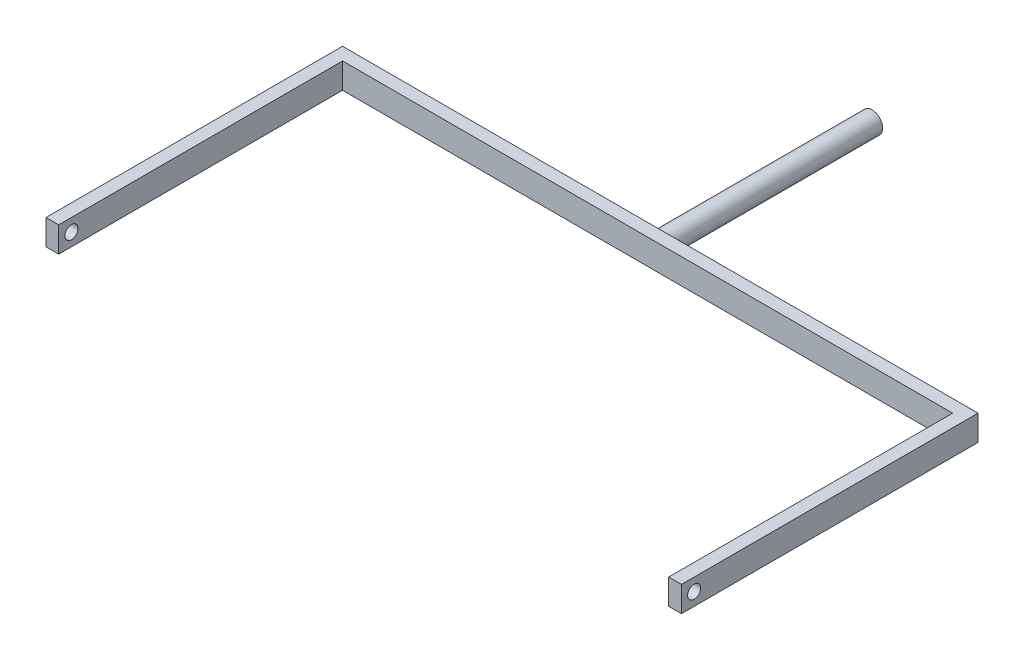
ISO-10303-21;
HEADER;
FILE_DESCRIPTION(('STEP AP214'),'2;1');
FILE_NAME('part.step','',(''),(''),'','','');
FILE_SCHEMA(('AUTOMOTIVE_DESIGN { 1 0 10303 214 1 1 1 1 }'));
ENDSEC;
DATA;
#1=APPLICATION_CONTEXT('core data for automotive mechanical design processes');
#2=APPLICATION_PROTOCOL_DEFINITION('international standard','automotive_design',2000,#1);
#3=PRODUCT_CONTEXT('',#1,'mechanical');
#4=PRODUCT('Part','Part','',(#3));
#5=PRODUCT_RELATED_PRODUCT_CATEGORY('part','',(#4));
#6=PRODUCT_DEFINITION_FORMATION('','',#4);
#7=PRODUCT_DEFINITION_CONTEXT('part definition',#1,'design');
#8=PRODUCT_DEFINITION('design','',#6,#7);
#9=PRODUCT_DEFINITION_SHAPE('','',#8);
#10=(LENGTH_UNIT() NAMED_UNIT(*) SI_UNIT(.MILLI.,.METRE.));
#11=(NAMED_UNIT(*) PLANE_ANGLE_UNIT() SI_UNIT($,.RADIAN.));
#12=(NAMED_UNIT(*) SI_UNIT($,.STERADIAN.) SOLID_ANGLE_UNIT());
#13=UNCERTAINTY_MEASURE_WITH_UNIT(LENGTH_MEASURE(1.E-05),#10,'distance_accuracy_value','');
#14=(GEOMETRIC_REPRESENTATION_CONTEXT(3) GLOBAL_UNCERTAINTY_ASSIGNED_CONTEXT((#13)) GLOBAL_UNIT_ASSIGNED_CONTEXT((#10,
#11,#12)) REPRESENTATION_CONTEXT('',''));
#15=CARTESIAN_POINT('',(0.,0.,0.));
#16=DIRECTION('',(0.,0.,1.));
#17=DIRECTION('',(1.,0.,0.));
#18=AXIS2_PLACEMENT_3D('',#15,#16,#17);
#19=CARTESIAN_POINT('',(0.,6.,1.48484848484847));
#20=DIRECTION('',(0.,0.,1.));
#21=DIRECTION('',(1.,0.,0.));
#22=AXIS2_PLACEMENT_3D('',#19,#20,#21);
#23=PLANE('',#22);
#24=DIRECTION('',(-1.,0.,0.));
#25=VECTOR('',#24,1.);
#26=CARTESIAN_POINT('',(0.,0.,1.48484848484847));
#27=LINE('',#26,#25);
#28=CARTESIAN_POINT('',(71.2424242424239,0.,1.48484848484846));
#29=VERTEX_POINT('',#28);
#30=CARTESIAN_POINT('',(-72.7575757575761,0.,1.48484848484851));
#31=VERTEX_POINT('',#30);
#32=EDGE_CURVE('E134',#29,#31,#27,.T.);
#33=ORIENTED_EDGE('',*,*,#32,.F.);
#34=DIRECTION('',(0.,-1.,0.));
#35=VECTOR('',#34,1.);
#36=CARTESIAN_POINT('',(71.2424242424239,6.,1.48484848484846));
#37=LINE('',#36,#35);
#38=CARTESIAN_POINT('',(71.2424242424239,6.,1.48484848484846));
#39=VERTEX_POINT('',#38);
#40=EDGE_CURVE('E45',#39,#29,#37,.T.);
#41=ORIENTED_EDGE('',*,*,#40,.F.);
#42=DIRECTION('',(-1.,0.,0.));
#43=VECTOR('',#42,1.);
#44=CARTESIAN_POINT('',(0.,6.,1.48484848484847));
#45=LINE('',#44,#43);
#46=CARTESIAN_POINT('',(-72.7575757575761,6.,1.48484848484851));
#47=VERTEX_POINT('',#46);
#48=EDGE_CURVE('E155',#39,#47,#45,.T.);
#49=ORIENTED_EDGE('',*,*,#48,.T.);
#50=DIRECTION('',(0.,-1.,0.));
#51=VECTOR('',#50,1.);
#52=CARTESIAN_POINT('',(-72.7575757575761,6.,1.48484848484851));
#53=LINE('',#52,#51);
#54=EDGE_CURVE('E53',#47,#31,#53,.T.);
#55=ORIENTED_EDGE('',*,*,#54,.T.);
#56=EDGE_LOOP('',(#33,#41,#49,#55));
#57=FACE_BOUND('',#56,.T.);
#58=ADVANCED_FACE('F37',(#57),#23,.T.);
#59=CARTESIAN_POINT('',(71.2424242424239,6.,0.));
#60=DIRECTION('',(1.,0.,0.));
#61=DIRECTION('',(0.,0.,-1.));
#62=AXIS2_PLACEMENT_3D('',#59,#60,#61);
#63=PLANE('',#62);
#64=CARTESIAN_POINT('',(71.2424242424239,3.,65.4848484848485));
#65=DIRECTION('',(1.,0.,0.));
#66=DIRECTION('',(0.,0.,-1.));
#67=AXIS2_PLACEMENT_3D('',#64,#65,#66);
#68=CIRCLE('',#67,1.54999999999999);
#69=CARTESIAN_POINT('',(71.2424242424239,3.,63.9348484848485));
#70=VERTEX_POINT('',#69);
#71=EDGE_CURVE('E229',#70,#70,#68,.T.);
#72=ORIENTED_EDGE('',*,*,#71,.T.);
#73=EDGE_LOOP('',(#72));
#74=FACE_BOUND('',#73,.T.);
#75=DIRECTION('',(0.,0.,1.));
#76=VECTOR('',#75,1.);
#77=CARTESIAN_POINT('',(71.2424242424239,0.,0.));
#78=LINE('',#77,#76);
#79=CARTESIAN_POINT('',(71.2424242424239,0.,68.4848484848485));
#80=VERTEX_POINT('',#79);
#81=EDGE_CURVE('E136',#29,#80,#78,.T.);
#82=ORIENTED_EDGE('',*,*,#81,.T.);
#83=DIRECTION('',(0.,-1.,0.));
#84=VECTOR('',#83,1.);
#85=CARTESIAN_POINT('',(71.2424242424239,6.,68.4848484848485));
#86=LINE('',#85,#84);
#87=CARTESIAN_POINT('',(71.2424242424239,6.,68.4848484848485));
#88=VERTEX_POINT('',#87);
#89=EDGE_CURVE('E163',#88,#80,#86,.T.);
#90=ORIENTED_EDGE('',*,*,#89,.F.);
#91=DIRECTION('',(0.,0.,1.));
#92=VECTOR('',#91,1.);
#93=CARTESIAN_POINT('',(71.2424242424239,6.,0.));
#94=LINE('',#93,#92);
#95=EDGE_CURVE('E168',#39,#88,#94,.T.);
#96=ORIENTED_EDGE('',*,*,#95,.F.);
#97=ORIENTED_EDGE('',*,*,#40,.T.);
#98=EDGE_LOOP('',(#82,#90,#96,#97));
#99=FACE_BOUND('',#98,.T.);
#100=ADVANCED_FACE('F166',(#74,#99),#63,.F.);
#101=CARTESIAN_POINT('',(0.,6.,68.4848484848485));
#102=DIRECTION('',(0.,0.,1.));
#103=DIRECTION('',(1.,0.,0.));
#104=AXIS2_PLACEMENT_3D('',#101,#102,#103);
#105=PLANE('',#104);
#106=DIRECTION('',(-1.,0.,0.));
#107=VECTOR('',#106,1.);
#108=CARTESIAN_POINT('',(0.,0.,68.4848484848485));
#109=LINE('',#108,#107);
#110=CARTESIAN_POINT('',(74.2424242424239,0.,68.4848484848485));
#111=VERTEX_POINT('',#110);
#112=EDGE_CURVE('E140',#111,#80,#109,.T.);
#113=ORIENTED_EDGE('',*,*,#112,.F.);
#114=DIRECTION('',(0.,-1.,0.));
#115=VECTOR('',#114,1.);
#116=CARTESIAN_POINT('',(74.2424242424239,6.,68.4848484848485));
#117=LINE('',#116,#115);
#118=CARTESIAN_POINT('',(74.2424242424239,6.,68.4848484848485));
#119=VERTEX_POINT('',#118);
#120=EDGE_CURVE('E161',#119,#111,#117,.T.);
#121=ORIENTED_EDGE('',*,*,#120,.F.);
#122=DIRECTION('',(-1.,0.,0.));
#123=VECTOR('',#122,1.);
#124=CARTESIAN_POINT('',(0.,6.,68.4848484848485));
#125=LINE('',#124,#123);
#126=EDGE_CURVE('E240',#119,#88,#125,.T.);
#127=ORIENTED_EDGE('',*,*,#126,.T.);
#128=ORIENTED_EDGE('',*,*,#89,.T.);
#129=EDGE_LOOP('',(#113,#121,#127,#128));
#130=FACE_BOUND('',#129,.T.);
#131=ADVANCED_FACE('F176',(#130),#105,.T.);
#132=CARTESIAN_POINT('',(74.2424242424239,6.,0.));
#133=DIRECTION('',(1.,0.,0.));
#134=DIRECTION('',(0.,0.,-1.));
#135=AXIS2_PLACEMENT_3D('',#132,#133,#134);
#136=PLANE('',#135);
#137=CARTESIAN_POINT('',(74.2424242424239,3.,65.4848484848485));
#138=DIRECTION('',(1.,0.,0.));
#139=DIRECTION('',(0.,0.,-1.));
#140=AXIS2_PLACEMENT_3D('',#137,#138,#139);
#141=CIRCLE('',#140,1.54999999999999);
#142=CARTESIAN_POINT('',(74.2424242424239,3.,63.9348484848485));
#143=VERTEX_POINT('',#142);
#144=EDGE_CURVE('E226',#143,#143,#141,.T.);
#145=ORIENTED_EDGE('',*,*,#144,.F.);
#146=EDGE_LOOP('',(#145));
#147=FACE_BOUND('',#146,.T.);
#148=DIRECTION('',(0.,0.,1.));
#149=VECTOR('',#148,1.);
#150=CARTESIAN_POINT('',(74.2424242424239,0.,0.));
#151=LINE('',#150,#149);
#152=CARTESIAN_POINT('',(74.2424242424239,0.,-1.51515151515152));
#153=VERTEX_POINT('',#152);
#154=EDGE_CURVE('E143',#153,#111,#151,.T.);
#155=ORIENTED_EDGE('',*,*,#154,.F.);
#156=DIRECTION('',(0.,-1.,0.));
#157=VECTOR('',#156,1.);
#158=CARTESIAN_POINT('',(74.2424242424239,6.,-1.51515151515152));
#159=LINE('',#158,#157);
#160=CARTESIAN_POINT('',(74.2424242424239,6.,-1.51515151515152));
#161=VERTEX_POINT('',#160);
#162=EDGE_CURVE('E159',#161,#153,#159,.T.);
#163=ORIENTED_EDGE('',*,*,#162,.F.);
#164=DIRECTION('',(0.,0.,1.));
#165=VECTOR('',#164,1.);
#166=CARTESIAN_POINT('',(74.2424242424239,6.,0.));
#167=LINE('',#166,#165);
#168=EDGE_CURVE('E129',#161,#119,#167,.T.);
#169=ORIENTED_EDGE('',*,*,#168,.T.);
#170=ORIENTED_EDGE('',*,*,#120,.T.);
#171=EDGE_LOOP('',(#155,#163,#169,#170));
#172=FACE_BOUND('',#171,.T.);
#173=ADVANCED_FACE('F181',(#147,#172),#136,.T.);
#174=CARTESIAN_POINT('',(0.,6.,-1.51515151515151));
#175=DIRECTION('',(0.,0.,1.));
#176=DIRECTION('',(1.,0.,0.));
#177=AXIS2_PLACEMENT_3D('',#174,#175,#176);
#178=PLANE('',#177);
#179=CARTESIAN_POINT('',(-0.757575757576096,3.,-1.51515151515151));
#180=DIRECTION('',(0.,0.,1.));
#181=DIRECTION('',(1.,0.,0.));
#182=AXIS2_PLACEMENT_3D('',#179,#180,#181);
#183=CIRCLE('',#182,2.5);
#184=CARTESIAN_POINT('',(1.7424242424239,3.,-1.51515151515151));
#185=VERTEX_POINT('',#184);
#186=EDGE_CURVE('E11',#185,#185,#183,.F.);
#187=ORIENTED_EDGE('',*,*,#186,.F.);
#188=EDGE_LOOP('',(#187));
#189=FACE_BOUND('',#188,.T.);
#190=DIRECTION('',(-1.,0.,0.));
#191=VECTOR('',#190,1.);
#192=CARTESIAN_POINT('',(0.,0.,-1.51515151515151));
#193=LINE('',#192,#191);
#194=CARTESIAN_POINT('',(-75.7575757575761,0.,-1.5151515151515));
#195=VERTEX_POINT('',#194);
#196=EDGE_CURVE('E146',#153,#195,#193,.T.);
#197=ORIENTED_EDGE('',*,*,#196,.T.);
#198=DIRECTION('',(0.,-1.,0.));
#199=VECTOR('',#198,1.);
#200=CARTESIAN_POINT('',(-75.7575757575761,6.,-1.5151515151515));
#201=LINE('',#200,#199);
#202=CARTESIAN_POINT('',(-75.7575757575761,6.,-1.5151515151515));
#203=VERTEX_POINT('',#202);
#204=EDGE_CURVE('E114',#203,#195,#201,.T.);
#205=ORIENTED_EDGE('',*,*,#204,.F.);
#206=DIRECTION('',(-1.,0.,0.));
#207=VECTOR('',#206,1.);
#208=CARTESIAN_POINT('',(0.,6.,-1.51515151515151));
#209=LINE('',#208,#207);
#210=EDGE_CURVE('E126',#161,#203,#209,.T.);
#211=ORIENTED_EDGE('',*,*,#210,.F.);
#212=ORIENTED_EDGE('',*,*,#162,.T.);
#213=EDGE_LOOP('',(#197,#205,#211,#212));
#214=FACE_BOUND('',#213,.T.);
#215=ADVANCED_FACE('F188',(#189,#214),#178,.F.);
#216=CARTESIAN_POINT('',(-75.7575757575761,6.,0.));
#217=DIRECTION('',(-1.,0.,0.));
#218=DIRECTION('',(0.,0.,1.));
#219=AXIS2_PLACEMENT_3D('',#216,#217,#218);
#220=PLANE('',#219);
#221=CARTESIAN_POINT('',(-75.7575757575761,3.,65.4848484848485));
#222=DIRECTION('',(-1.,0.,0.));
#223=DIRECTION('',(0.,0.,1.));
#224=AXIS2_PLACEMENT_3D('',#221,#222,#223);
#225=CIRCLE('',#224,1.54999999999999);
#226=CARTESIAN_POINT('',(-75.7575757575761,3.,67.0348484848485));
#227=VERTEX_POINT('',#226);
#228=EDGE_CURVE('E137',#227,#227,#225,.T.);
#229=ORIENTED_EDGE('',*,*,#228,.F.);
#230=EDGE_LOOP('',(#229));
#231=FACE_BOUND('',#230,.T.);
#232=DIRECTION('',(0.,0.,-1.));
#233=VECTOR('',#232,1.);
#234=CARTESIAN_POINT('',(-75.7575757575761,0.,0.));
#235=LINE('',#234,#233);
#236=CARTESIAN_POINT('',(-75.7575757575761,0.,68.4848484848485));
#237=VERTEX_POINT('',#236);
#238=EDGE_CURVE('E111',#237,#195,#235,.T.);
#239=ORIENTED_EDGE('',*,*,#238,.F.);
#240=DIRECTION('',(0.,-1.,0.));
#241=VECTOR('',#240,1.);
#242=CARTESIAN_POINT('',(-75.7575757575761,6.,68.4848484848485));
#243=LINE('',#242,#241);
#244=CARTESIAN_POINT('',(-75.7575757575761,6.,68.4848484848485));
#245=VERTEX_POINT('',#244);
#246=EDGE_CURVE('E105',#245,#237,#243,.T.);
#247=ORIENTED_EDGE('',*,*,#246,.F.);
#248=DIRECTION('',(0.,0.,-1.));
#249=VECTOR('',#248,1.);
#250=CARTESIAN_POINT('',(-75.7575757575761,6.,0.));
#251=LINE('',#250,#249);
#252=EDGE_CURVE('E109',#245,#203,#251,.T.);
#253=ORIENTED_EDGE('',*,*,#252,.T.);
#254=ORIENTED_EDGE('',*,*,#204,.T.);
#255=EDGE_LOOP('',(#239,#247,#253,#254));
#256=FACE_BOUND('',#255,.T.);
#257=ADVANCED_FACE('F107',(#231,#256),#220,.T.);
#258=CARTESIAN_POINT('',(-3.16806065107685E-13,6.,68.4848484848488));
#259=DIRECTION('',(0.,0.,-1.));
#260=DIRECTION('',(-1.,0.,0.));
#261=AXIS2_PLACEMENT_3D('',#258,#259,#260);
#262=PLANE('',#261);
#263=DIRECTION('',(1.,0.,0.));
#264=VECTOR('',#263,1.);
#265=CARTESIAN_POINT('',(-3.16806065107685E-13,0.,68.4848484848488));
#266=LINE('',#265,#264);
#267=CARTESIAN_POINT('',(-72.7575757575761,0.,68.4848484848485));
#268=VERTEX_POINT('',#267);
#269=EDGE_CURVE('E150',#237,#268,#266,.T.);
#270=ORIENTED_EDGE('',*,*,#269,.T.);
#271=DIRECTION('',(0.,-1.,0.));
#272=VECTOR('',#271,1.);
#273=CARTESIAN_POINT('',(-72.7575757575761,6.,68.4848484848485));
#274=LINE('',#273,#272);
#275=CARTESIAN_POINT('',(-72.7575757575761,6.,68.4848484848485));
#276=VERTEX_POINT('',#275);
#277=EDGE_CURVE('E80',#276,#268,#274,.T.);
#278=ORIENTED_EDGE('',*,*,#277,.F.);
#279=DIRECTION('',(1.,0.,0.));
#280=VECTOR('',#279,1.);
#281=CARTESIAN_POINT('',(-3.16806065107685E-13,6.,68.4848484848488));
#282=LINE('',#281,#280);
#283=EDGE_CURVE('E116',#245,#276,#282,.T.);
#284=ORIENTED_EDGE('',*,*,#283,.F.);
#285=ORIENTED_EDGE('',*,*,#246,.T.);
#286=EDGE_LOOP('',(#270,#278,#284,#285));
#287=FACE_BOUND('',#286,.T.);
#288=ADVANCED_FACE('F117',(#287),#262,.F.);
#289=CARTESIAN_POINT('',(-72.7575757575761,6.,0.));
#290=DIRECTION('',(1.,0.,0.));
#291=DIRECTION('',(0.,0.,-1.));
#292=AXIS2_PLACEMENT_3D('',#289,#290,#291);
#293=PLANE('',#292);
#294=CARTESIAN_POINT('',(-72.7575757575761,3.,65.4848484848485));
#295=DIRECTION('',(1.,0.,0.));
#296=DIRECTION('',(0.,0.,-1.));
#297=AXIS2_PLACEMENT_3D('',#294,#295,#296);
#298=CIRCLE('',#297,1.54999999999999);
#299=CARTESIAN_POINT('',(-72.7575757575761,3.,63.9348484848485));
#300=VERTEX_POINT('',#299);
#301=EDGE_CURVE('E233',#300,#300,#298,.T.);
#302=ORIENTED_EDGE('',*,*,#301,.F.);
#303=EDGE_LOOP('',(#302));
#304=FACE_BOUND('',#303,.T.);
#305=DIRECTION('',(0.,0.,1.));
#306=VECTOR('',#305,1.);
#307=CARTESIAN_POINT('',(-72.7575757575761,0.,0.));
#308=LINE('',#307,#306);
#309=EDGE_CURVE('E152',#31,#268,#308,.T.);
#310=ORIENTED_EDGE('',*,*,#309,.F.);
#311=ORIENTED_EDGE('',*,*,#54,.F.);
#312=DIRECTION('',(0.,0.,1.));
#313=VECTOR('',#312,1.);
#314=CARTESIAN_POINT('',(-72.7575757575761,6.,0.));
#315=LINE('',#314,#313);
#316=EDGE_CURVE('E120',#47,#276,#315,.T.);
#317=ORIENTED_EDGE('',*,*,#316,.T.);
#318=ORIENTED_EDGE('',*,*,#277,.T.);
#319=EDGE_LOOP('',(#310,#311,#317,#318));
#320=FACE_BOUND('',#319,.T.);
#321=ADVANCED_FACE('F198',(#304,#320),#293,.T.);
#322=CARTESIAN_POINT('',(0.,6.,0.));
#323=DIRECTION('',(0.,1.,0.));
#324=DIRECTION('',(0.,0.,1.));
#325=AXIS2_PLACEMENT_3D('',#322,#323,#324);
#326=PLANE('',#325);
#327=ORIENTED_EDGE('',*,*,#48,.F.);
#328=ORIENTED_EDGE('',*,*,#95,.T.);
#329=ORIENTED_EDGE('',*,*,#126,.F.);
#330=ORIENTED_EDGE('',*,*,#168,.F.);
#331=ORIENTED_EDGE('',*,*,#210,.T.);
#332=ORIENTED_EDGE('',*,*,#252,.F.);
#333=ORIENTED_EDGE('',*,*,#283,.T.);
#334=ORIENTED_EDGE('',*,*,#316,.F.);
#335=EDGE_LOOP('',(#327,#328,#329,#330,#331,#332,#333,#334));
#336=FACE_BOUND('',#335,.T.);
#337=ADVANCED_FACE('F123',(#336),#326,.T.);
#338=CARTESIAN_POINT('',(0.,0.,0.));
#339=DIRECTION('',(0.,1.,0.));
#340=DIRECTION('',(0.,0.,1.));
#341=AXIS2_PLACEMENT_3D('',#338,#339,#340);
#342=PLANE('',#341);
#343=ORIENTED_EDGE('',*,*,#32,.T.);
#344=ORIENTED_EDGE('',*,*,#309,.T.);
#345=ORIENTED_EDGE('',*,*,#269,.F.);
#346=ORIENTED_EDGE('',*,*,#238,.T.);
#347=ORIENTED_EDGE('',*,*,#196,.F.);
#348=ORIENTED_EDGE('',*,*,#154,.T.);
#349=ORIENTED_EDGE('',*,*,#112,.T.);
#350=ORIENTED_EDGE('',*,*,#81,.F.);
#351=EDGE_LOOP('',(#343,#344,#345,#346,#347,#348,#349,#350));
#352=FACE_BOUND('',#351,.T.);
#353=ADVANCED_FACE('F170',(#352),#342,.F.);
#354=CARTESIAN_POINT('',(-82.7575757575761,3.,65.4848484848485));
#355=DIRECTION('',(1.,0.,0.));
#356=DIRECTION('',(0.,0.,-1.));
#357=AXIS2_PLACEMENT_3D('',#354,#355,#356);
#358=CYLINDRICAL_SURFACE('',#357,1.54999999999999);
#359=ORIENTED_EDGE('',*,*,#228,.T.);
#360=EDGE_LOOP('',(#359));
#361=FACE_BOUND('',#360,.T.);
#362=ORIENTED_EDGE('',*,*,#301,.T.);
#363=EDGE_LOOP('',(#362));
#364=FACE_BOUND('',#363,.T.);
#365=ADVANCED_FACE('F204',(#361,#364),#358,.F.);
#366=CARTESIAN_POINT('',(64.2424242424239,3.,65.4848484848485));
#367=DIRECTION('',(1.,0.,0.));
#368=DIRECTION('',(0.,0.,-1.));
#369=AXIS2_PLACEMENT_3D('',#366,#367,#368);
#370=CYLINDRICAL_SURFACE('',#369,1.54999999999999);
#371=ORIENTED_EDGE('',*,*,#144,.T.);
#372=EDGE_LOOP('',(#371));
#373=FACE_BOUND('',#372,.T.);
#374=ORIENTED_EDGE('',*,*,#71,.F.);
#375=EDGE_LOOP('',(#374));
#376=FACE_BOUND('',#375,.T.);
#377=ADVANCED_FACE('F209',(#373,#376),#370,.F.);
#378=CARTESIAN_POINT('',(-0.757575757576102,3.,-51.5151515151515));
#379=DIRECTION('',(0.,0.,1.));
#380=DIRECTION('',(1.,0.,0.));
#381=AXIS2_PLACEMENT_3D('',#378,#379,#380);
#382=CYLINDRICAL_SURFACE('',#381,2.5);
#383=CARTESIAN_POINT('',(-0.757575757576102,3.,-51.5151515151515));
#384=DIRECTION('',(0.,0.,-1.));
#385=DIRECTION('',(-1.,0.,0.));
#386=AXIS2_PLACEMENT_3D('',#383,#384,#385);
#387=CIRCLE('',#386,2.5);
#388=CARTESIAN_POINT('',(-3.2575757575761,3.,-51.5151515151515));
#389=VERTEX_POINT('',#388);
#390=EDGE_CURVE('E225',#389,#389,#387,.T.);
#391=ORIENTED_EDGE('',*,*,#390,.F.);
#392=EDGE_LOOP('',(#391));
#393=FACE_BOUND('',#392,.T.);
#394=ORIENTED_EDGE('',*,*,#186,.T.);
#395=EDGE_LOOP('',(#394));
#396=FACE_BOUND('',#395,.T.);
#397=ADVANCED_FACE('F213',(#393,#396),#382,.T.);
#398=CARTESIAN_POINT('',(-0.757575757576102,3.,-51.5151515151515));
#399=DIRECTION('',(0.,0.,-1.));
#400=DIRECTION('',(-1.,0.,0.));
#401=AXIS2_PLACEMENT_3D('',#398,#399,#400);
#402=PLANE('',#401);
#403=ORIENTED_EDGE('',*,*,#390,.T.);
#404=EDGE_LOOP('',(#403));
#405=FACE_BOUND('',#404,.T.);
#406=ADVANCED_FACE('F217',(#405),#402,.T.);
#407=CLOSED_SHELL('',(#58,#100,#131,#173,#215,#257,#288,#321,#337,#353,#365,#377,#397,#406));
#408=MANIFOLD_SOLID_BREP('B2',#407);
#409=ADVANCED_BREP_SHAPE_REPRESENTATION('',(#18,#408),#14);
#410=SHAPE_DEFINITION_REPRESENTATION(#9,#409);
ENDSEC;
END-ISO-10303-21;
